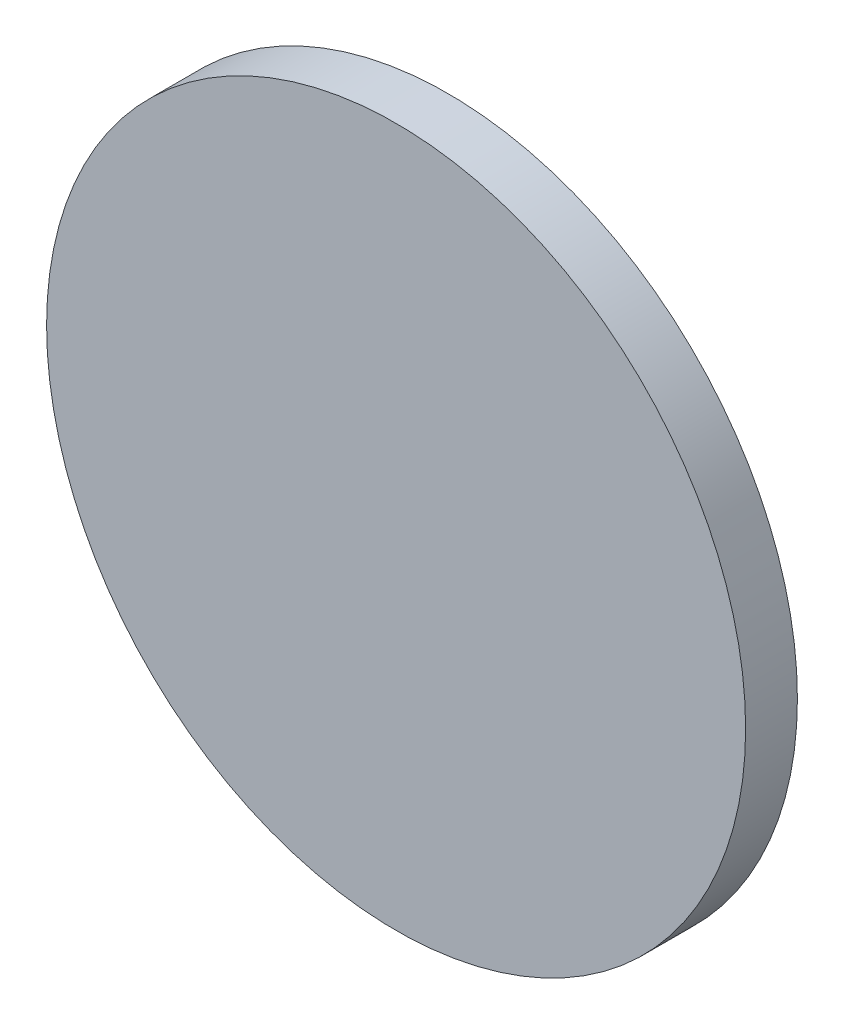
ISO-10303-21;
HEADER;
FILE_DESCRIPTION(('STEP AP214'),'2;1');
FILE_NAME('part.step','',(''),(''),'','','');
FILE_SCHEMA(('AUTOMOTIVE_DESIGN { 1 0 10303 214 1 1 1 1 }'));
ENDSEC;
DATA;
#1=APPLICATION_CONTEXT('core data for automotive mechanical design processes');
#2=APPLICATION_PROTOCOL_DEFINITION('international standard','automotive_design',2000,#1);
#3=PRODUCT_CONTEXT('',#1,'mechanical');
#4=PRODUCT('Part','Part','',(#3));
#5=PRODUCT_RELATED_PRODUCT_CATEGORY('part','',(#4));
#6=PRODUCT_DEFINITION_FORMATION('','',#4);
#7=PRODUCT_DEFINITION_CONTEXT('part definition',#1,'design');
#8=PRODUCT_DEFINITION('design','',#6,#7);
#9=PRODUCT_DEFINITION_SHAPE('','',#8);
#10=(LENGTH_UNIT() NAMED_UNIT(*) SI_UNIT(.MILLI.,.METRE.));
#11=(NAMED_UNIT(*) PLANE_ANGLE_UNIT() SI_UNIT($,.RADIAN.));
#12=(NAMED_UNIT(*) SI_UNIT($,.STERADIAN.) SOLID_ANGLE_UNIT());
#13=UNCERTAINTY_MEASURE_WITH_UNIT(LENGTH_MEASURE(1.E-05),#10,'distance_accuracy_value','');
#14=(GEOMETRIC_REPRESENTATION_CONTEXT(3) GLOBAL_UNCERTAINTY_ASSIGNED_CONTEXT((#13)) GLOBAL_UNIT_ASSIGNED_CONTEXT((#10,
#11,#12)) REPRESENTATION_CONTEXT('',''));
#15=CARTESIAN_POINT('',(0.,0.,0.));
#16=DIRECTION('',(0.,0.,1.));
#17=DIRECTION('',(1.,0.,0.));
#18=AXIS2_PLACEMENT_3D('',#15,#16,#17);
#19=CARTESIAN_POINT('',(0.,0.,-0.8));
#20=DIRECTION('',(0.,0.,1.));
#21=DIRECTION('',(1.,0.,0.));
#22=AXIS2_PLACEMENT_3D('',#19,#20,#21);
#23=CYLINDRICAL_SURFACE('',#22,5.4);
#24=CARTESIAN_POINT('',(0.,0.,-0.8));
#25=DIRECTION('',(0.,0.,1.));
#26=DIRECTION('',(1.,0.,0.));
#27=AXIS2_PLACEMENT_3D('',#24,#25,#26);
#28=CIRCLE('',#27,5.4);
#29=CARTESIAN_POINT('',(5.4,0.,-0.8));
#30=VERTEX_POINT('',#29);
#31=EDGE_CURVE('E10',#30,#30,#28,.T.);
#32=ORIENTED_EDGE('',*,*,#31,.T.);
#33=EDGE_LOOP('',(#32));
#34=FACE_BOUND('',#33,.T.);
#35=CARTESIAN_POINT('',(0.,0.,0.));
#36=DIRECTION('',(0.,0.,1.));
#37=DIRECTION('',(1.,0.,0.));
#38=AXIS2_PLACEMENT_3D('',#35,#36,#37);
#39=CIRCLE('',#38,5.4);
#40=CARTESIAN_POINT('',(5.4,0.,0.));
#41=VERTEX_POINT('',#40);
#42=EDGE_CURVE('E33',#41,#41,#39,.T.);
#43=ORIENTED_EDGE('',*,*,#42,.F.);
#44=EDGE_LOOP('',(#43));
#45=FACE_BOUND('',#44,.T.);
#46=ADVANCED_FACE('F30',(#34,#45),#23,.T.);
#47=CARTESIAN_POINT('',(0.,0.,-0.8));
#48=DIRECTION('',(0.,0.,1.));
#49=DIRECTION('',(1.,0.,0.));
#50=AXIS2_PLACEMENT_3D('',#47,#48,#49);
#51=PLANE('',#50);
#52=ORIENTED_EDGE('',*,*,#31,.F.);
#53=EDGE_LOOP('',(#52));
#54=FACE_BOUND('',#53,.T.);
#55=ADVANCED_FACE('F45',(#54),#51,.F.);
#56=CARTESIAN_POINT('',(0.,0.,0.));
#57=DIRECTION('',(0.,0.,1.));
#58=DIRECTION('',(1.,0.,0.));
#59=AXIS2_PLACEMENT_3D('',#56,#57,#58);
#60=PLANE('',#59);
#61=ORIENTED_EDGE('',*,*,#42,.T.);
#62=EDGE_LOOP('',(#61));
#63=FACE_BOUND('',#62,.T.);
#64=ADVANCED_FACE('F42',(#63),#60,.T.);
#65=CLOSED_SHELL('',(#46,#55,#64));
#66=MANIFOLD_SOLID_BREP('B2',#65);
#67=ADVANCED_BREP_SHAPE_REPRESENTATION('',(#18,#66),#14);
#68=SHAPE_DEFINITION_REPRESENTATION(#9,#67);
ENDSEC;
END-ISO-10303-21;
